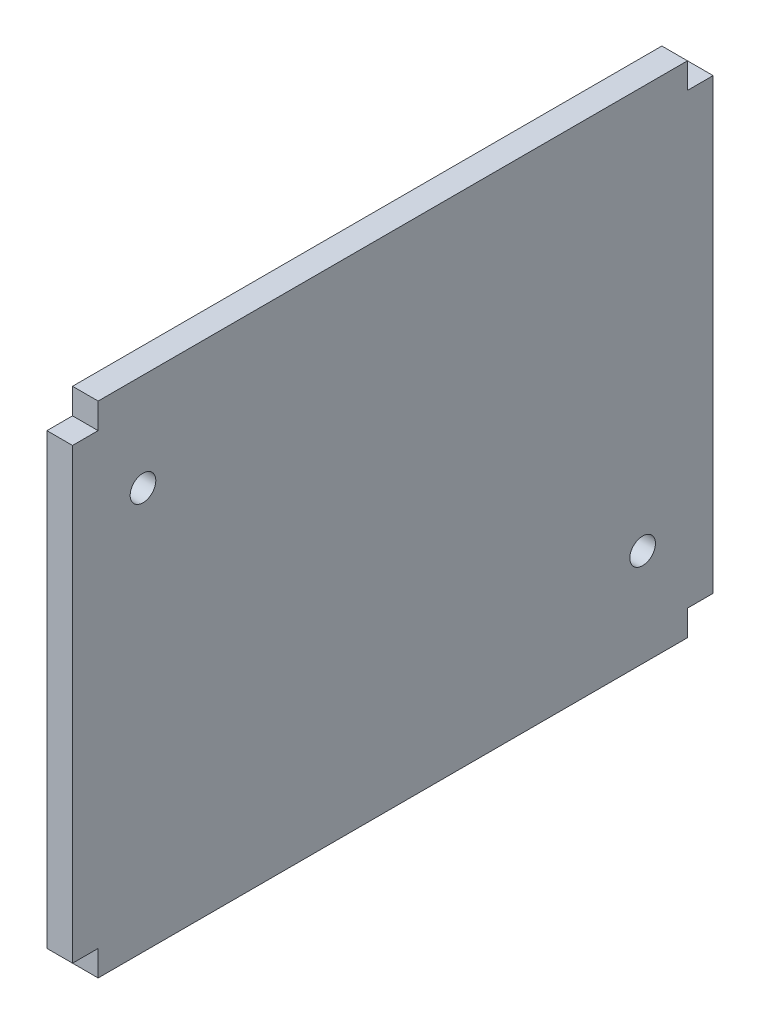
ISO-10303-21;
HEADER;
FILE_DESCRIPTION(('STEP AP214'),'2;1');
FILE_NAME('part.step','',(''),(''),'','','');
FILE_SCHEMA(('AUTOMOTIVE_DESIGN { 1 0 10303 214 1 1 1 1 }'));
ENDSEC;
DATA;
#1=APPLICATION_CONTEXT('core data for automotive mechanical design processes');
#2=APPLICATION_PROTOCOL_DEFINITION('international standard','automotive_design',2000,#1);
#3=PRODUCT_CONTEXT('',#1,'mechanical');
#4=PRODUCT('Part','Part','',(#3));
#5=PRODUCT_RELATED_PRODUCT_CATEGORY('part','',(#4));
#6=PRODUCT_DEFINITION_FORMATION('','',#4);
#7=PRODUCT_DEFINITION_CONTEXT('part definition',#1,'design');
#8=PRODUCT_DEFINITION('design','',#6,#7);
#9=PRODUCT_DEFINITION_SHAPE('','',#8);
#10=(LENGTH_UNIT() NAMED_UNIT(*) SI_UNIT(.MILLI.,.METRE.));
#11=(NAMED_UNIT(*) PLANE_ANGLE_UNIT() SI_UNIT($,.RADIAN.));
#12=(NAMED_UNIT(*) SI_UNIT($,.STERADIAN.) SOLID_ANGLE_UNIT());
#13=UNCERTAINTY_MEASURE_WITH_UNIT(LENGTH_MEASURE(1.E-05),#10,'distance_accuracy_value','');
#14=(GEOMETRIC_REPRESENTATION_CONTEXT(3) GLOBAL_UNCERTAINTY_ASSIGNED_CONTEXT((#13)) GLOBAL_UNIT_ASSIGNED_CONTEXT((#10,
#11,#12)) REPRESENTATION_CONTEXT('',''));
#15=CARTESIAN_POINT('',(0.,0.,0.));
#16=DIRECTION('',(0.,0.,1.));
#17=DIRECTION('',(1.,0.,0.));
#18=AXIS2_PLACEMENT_3D('',#15,#16,#17);
#19=CARTESIAN_POINT('',(4.,0.,50.));
#20=DIRECTION('',(0.,0.,-1.));
#21=DIRECTION('',(-1.,0.,0.));
#22=AXIS2_PLACEMENT_3D('',#19,#20,#21);
#23=PLANE('',#22);
#24=DIRECTION('',(0.,-1.,0.));
#25=VECTOR('',#24,1.);
#26=CARTESIAN_POINT('',(0.,0.,50.));
#27=LINE('',#26,#25);
#28=CARTESIAN_POINT('',(0.,35.,50.));
#29=VERTEX_POINT('',#28);
#30=CARTESIAN_POINT('',(0.,-35.,50.));
#31=VERTEX_POINT('',#30);
#32=EDGE_CURVE('E153',#29,#31,#27,.T.);
#33=ORIENTED_EDGE('',*,*,#32,.T.);
#34=DIRECTION('',(-1.,0.,0.));
#35=VECTOR('',#34,1.);
#36=CARTESIAN_POINT('',(4.,-35.,50.));
#37=LINE('',#36,#35);
#38=CARTESIAN_POINT('',(4.,-35.,50.));
#39=VERTEX_POINT('',#38);
#40=EDGE_CURVE('E11',#39,#31,#37,.T.);
#41=ORIENTED_EDGE('',*,*,#40,.F.);
#42=DIRECTION('',(0.,-1.,0.));
#43=VECTOR('',#42,1.);
#44=CARTESIAN_POINT('',(4.,0.,50.));
#45=LINE('',#44,#43);
#46=CARTESIAN_POINT('',(4.,35.,50.));
#47=VERTEX_POINT('',#46);
#48=EDGE_CURVE('E183',#47,#39,#45,.T.);
#49=ORIENTED_EDGE('',*,*,#48,.F.);
#50=DIRECTION('',(-1.,0.,0.));
#51=VECTOR('',#50,1.);
#52=CARTESIAN_POINT('',(4.,35.,50.));
#53=LINE('',#52,#51);
#54=EDGE_CURVE('E49',#47,#29,#53,.T.);
#55=ORIENTED_EDGE('',*,*,#54,.T.);
#56=EDGE_LOOP('',(#33,#41,#49,#55));
#57=FACE_BOUND('',#56,.T.);
#58=ADVANCED_FACE('F33',(#57),#23,.F.);
#59=CARTESIAN_POINT('',(4.,-35.,0.));
#60=DIRECTION('',(0.,1.,0.));
#61=DIRECTION('',(0.,0.,1.));
#62=AXIS2_PLACEMENT_3D('',#59,#60,#61);
#63=PLANE('',#62);
#64=DIRECTION('',(0.,0.,-1.));
#65=VECTOR('',#64,1.);
#66=CARTESIAN_POINT('',(0.,-35.,0.));
#67=LINE('',#66,#65);
#68=CARTESIAN_POINT('',(0.,-35.,46.));
#69=VERTEX_POINT('',#68);
#70=EDGE_CURVE('E155',#31,#69,#67,.T.);
#71=ORIENTED_EDGE('',*,*,#70,.T.);
#72=DIRECTION('',(-1.,0.,0.));
#73=VECTOR('',#72,1.);
#74=CARTESIAN_POINT('',(4.,-35.,46.));
#75=LINE('',#74,#73);
#76=CARTESIAN_POINT('',(4.,-35.,46.));
#77=VERTEX_POINT('',#76);
#78=EDGE_CURVE('E41',#77,#69,#75,.T.);
#79=ORIENTED_EDGE('',*,*,#78,.F.);
#80=DIRECTION('',(0.,0.,-1.));
#81=VECTOR('',#80,1.);
#82=CARTESIAN_POINT('',(4.,-35.,0.));
#83=LINE('',#82,#81);
#84=EDGE_CURVE('E99',#39,#77,#83,.T.);
#85=ORIENTED_EDGE('',*,*,#84,.F.);
#86=ORIENTED_EDGE('',*,*,#40,.T.);
#87=EDGE_LOOP('',(#71,#79,#85,#86));
#88=FACE_BOUND('',#87,.T.);
#89=ADVANCED_FACE('F253',(#88),#63,.F.);
#90=CARTESIAN_POINT('',(4.,0.,46.));
#91=DIRECTION('',(0.,0.,-1.));
#92=DIRECTION('',(-1.,0.,0.));
#93=AXIS2_PLACEMENT_3D('',#90,#91,#92);
#94=PLANE('',#93);
#95=DIRECTION('',(0.,-1.,0.));
#96=VECTOR('',#95,1.);
#97=CARTESIAN_POINT('',(0.,0.,46.));
#98=LINE('',#97,#96);
#99=CARTESIAN_POINT('',(0.,-39.,46.));
#100=VERTEX_POINT('',#99);
#101=EDGE_CURVE('E158',#69,#100,#98,.T.);
#102=ORIENTED_EDGE('',*,*,#101,.T.);
#103=DIRECTION('',(-1.,0.,0.));
#104=VECTOR('',#103,1.);
#105=CARTESIAN_POINT('',(4.,-39.,46.));
#106=LINE('',#105,#104);
#107=CARTESIAN_POINT('',(4.,-39.,46.));
#108=VERTEX_POINT('',#107);
#109=EDGE_CURVE('E198',#108,#100,#106,.T.);
#110=ORIENTED_EDGE('',*,*,#109,.F.);
#111=DIRECTION('',(0.,-1.,0.));
#112=VECTOR('',#111,1.);
#113=CARTESIAN_POINT('',(4.,0.,46.));
#114=LINE('',#113,#112);
#115=EDGE_CURVE('E206',#77,#108,#114,.T.);
#116=ORIENTED_EDGE('',*,*,#115,.F.);
#117=ORIENTED_EDGE('',*,*,#78,.T.);
#118=EDGE_LOOP('',(#102,#110,#116,#117));
#119=FACE_BOUND('',#118,.T.);
#120=ADVANCED_FACE('F204',(#119),#94,.F.);
#121=CARTESIAN_POINT('',(4.,-39.,0.));
#122=DIRECTION('',(0.,1.,0.));
#123=DIRECTION('',(0.,0.,1.));
#124=AXIS2_PLACEMENT_3D('',#121,#122,#123);
#125=PLANE('',#124);
#126=DIRECTION('',(0.,0.,-1.));
#127=VECTOR('',#126,1.);
#128=CARTESIAN_POINT('',(0.,-39.,0.));
#129=LINE('',#128,#127);
#130=CARTESIAN_POINT('',(0.,-39.,-46.));
#131=VERTEX_POINT('',#130);
#132=EDGE_CURVE('E160',#100,#131,#129,.T.);
#133=ORIENTED_EDGE('',*,*,#132,.T.);
#134=DIRECTION('',(-1.,0.,0.));
#135=VECTOR('',#134,1.);
#136=CARTESIAN_POINT('',(4.,-39.,-46.));
#137=LINE('',#136,#135);
#138=CARTESIAN_POINT('',(4.,-39.,-46.));
#139=VERTEX_POINT('',#138);
#140=EDGE_CURVE('E196',#139,#131,#137,.T.);
#141=ORIENTED_EDGE('',*,*,#140,.F.);
#142=DIRECTION('',(0.,0.,-1.));
#143=VECTOR('',#142,1.);
#144=CARTESIAN_POINT('',(4.,-39.,0.));
#145=LINE('',#144,#143);
#146=EDGE_CURVE('E216',#108,#139,#145,.T.);
#147=ORIENTED_EDGE('',*,*,#146,.F.);
#148=ORIENTED_EDGE('',*,*,#109,.T.);
#149=EDGE_LOOP('',(#133,#141,#147,#148));
#150=FACE_BOUND('',#149,.T.);
#151=ADVANCED_FACE('F213',(#150),#125,.F.);
#152=CARTESIAN_POINT('',(4.,0.,-46.));
#153=DIRECTION('',(0.,0.,-1.));
#154=DIRECTION('',(-1.,0.,0.));
#155=AXIS2_PLACEMENT_3D('',#152,#153,#154);
#156=PLANE('',#155);
#157=DIRECTION('',(0.,-1.,0.));
#158=VECTOR('',#157,1.);
#159=CARTESIAN_POINT('',(0.,0.,-46.));
#160=LINE('',#159,#158);
#161=CARTESIAN_POINT('',(0.,-35.,-46.));
#162=VERTEX_POINT('',#161);
#163=EDGE_CURVE('E163',#162,#131,#160,.T.);
#164=ORIENTED_EDGE('',*,*,#163,.F.);
#165=DIRECTION('',(-1.,0.,0.));
#166=VECTOR('',#165,1.);
#167=CARTESIAN_POINT('',(4.,-35.,-46.));
#168=LINE('',#167,#166);
#169=CARTESIAN_POINT('',(4.,-35.,-46.));
#170=VERTEX_POINT('',#169);
#171=EDGE_CURVE('E194',#170,#162,#168,.T.);
#172=ORIENTED_EDGE('',*,*,#171,.F.);
#173=DIRECTION('',(0.,-1.,0.));
#174=VECTOR('',#173,1.);
#175=CARTESIAN_POINT('',(4.,0.,-46.));
#176=LINE('',#175,#174);
#177=EDGE_CURVE('E218',#170,#139,#176,.T.);
#178=ORIENTED_EDGE('',*,*,#177,.T.);
#179=ORIENTED_EDGE('',*,*,#140,.T.);
#180=EDGE_LOOP('',(#164,#172,#178,#179));
#181=FACE_BOUND('',#180,.T.);
#182=ADVANCED_FACE('F366',(#181),#156,.T.);
#183=CARTESIAN_POINT('',(4.,-35.,0.));
#184=DIRECTION('',(0.,-1.,0.));
#185=DIRECTION('',(0.,0.,-1.));
#186=AXIS2_PLACEMENT_3D('',#183,#184,#185);
#187=PLANE('',#186);
#188=DIRECTION('',(0.,0.,1.));
#189=VECTOR('',#188,1.);
#190=CARTESIAN_POINT('',(0.,-35.,0.));
#191=LINE('',#190,#189);
#192=CARTESIAN_POINT('',(0.,-35.,-50.));
#193=VERTEX_POINT('',#192);
#194=EDGE_CURVE('E166',#193,#162,#191,.T.);
#195=ORIENTED_EDGE('',*,*,#194,.F.);
#196=DIRECTION('',(-1.,0.,0.));
#197=VECTOR('',#196,1.);
#198=CARTESIAN_POINT('',(4.,-35.,-50.));
#199=LINE('',#198,#197);
#200=CARTESIAN_POINT('',(4.,-35.,-50.));
#201=VERTEX_POINT('',#200);
#202=EDGE_CURVE('E192',#201,#193,#199,.T.);
#203=ORIENTED_EDGE('',*,*,#202,.F.);
#204=DIRECTION('',(0.,0.,1.));
#205=VECTOR('',#204,1.);
#206=CARTESIAN_POINT('',(4.,-35.,0.));
#207=LINE('',#206,#205);
#208=EDGE_CURVE('E220',#201,#170,#207,.T.);
#209=ORIENTED_EDGE('',*,*,#208,.T.);
#210=ORIENTED_EDGE('',*,*,#171,.T.);
#211=EDGE_LOOP('',(#195,#203,#209,#210));
#212=FACE_BOUND('',#211,.T.);
#213=ADVANCED_FACE('F356',(#212),#187,.T.);
#214=CARTESIAN_POINT('',(4.,0.,-50.));
#215=DIRECTION('',(0.,0.,-1.));
#216=DIRECTION('',(-1.,0.,0.));
#217=AXIS2_PLACEMENT_3D('',#214,#215,#216);
#218=PLANE('',#217);
#219=DIRECTION('',(0.,-1.,0.));
#220=VECTOR('',#219,1.);
#221=CARTESIAN_POINT('',(0.,0.,-50.));
#222=LINE('',#221,#220);
#223=CARTESIAN_POINT('',(0.,35.,-50.));
#224=VERTEX_POINT('',#223);
#225=EDGE_CURVE('E169',#224,#193,#222,.T.);
#226=ORIENTED_EDGE('',*,*,#225,.F.);
#227=DIRECTION('',(-1.,0.,0.));
#228=VECTOR('',#227,1.);
#229=CARTESIAN_POINT('',(4.,35.,-50.));
#230=LINE('',#229,#228);
#231=CARTESIAN_POINT('',(4.,35.,-50.));
#232=VERTEX_POINT('',#231);
#233=EDGE_CURVE('E190',#232,#224,#230,.T.);
#234=ORIENTED_EDGE('',*,*,#233,.F.);
#235=DIRECTION('',(0.,-1.,0.));
#236=VECTOR('',#235,1.);
#237=CARTESIAN_POINT('',(4.,0.,-50.));
#238=LINE('',#237,#236);
#239=EDGE_CURVE('E227',#232,#201,#238,.T.);
#240=ORIENTED_EDGE('',*,*,#239,.T.);
#241=ORIENTED_EDGE('',*,*,#202,.T.);
#242=EDGE_LOOP('',(#226,#234,#240,#241));
#243=FACE_BOUND('',#242,.T.);
#244=ADVANCED_FACE('F347',(#243),#218,.T.);
#245=CARTESIAN_POINT('',(4.,35.,0.));
#246=DIRECTION('',(0.,-1.,0.));
#247=DIRECTION('',(0.,0.,-1.));
#248=AXIS2_PLACEMENT_3D('',#245,#246,#247);
#249=PLANE('',#248);
#250=DIRECTION('',(0.,0.,1.));
#251=VECTOR('',#250,1.);
#252=CARTESIAN_POINT('',(0.,35.,0.));
#253=LINE('',#252,#251);
#254=CARTESIAN_POINT('',(0.,35.,-46.));
#255=VERTEX_POINT('',#254);
#256=EDGE_CURVE('E172',#224,#255,#253,.T.);
#257=ORIENTED_EDGE('',*,*,#256,.T.);
#258=DIRECTION('',(-1.,0.,0.));
#259=VECTOR('',#258,1.);
#260=CARTESIAN_POINT('',(4.,35.,-46.));
#261=LINE('',#260,#259);
#262=CARTESIAN_POINT('',(4.,35.,-46.));
#263=VERTEX_POINT('',#262);
#264=EDGE_CURVE('E187',#263,#255,#261,.T.);
#265=ORIENTED_EDGE('',*,*,#264,.F.);
#266=DIRECTION('',(0.,0.,1.));
#267=VECTOR('',#266,1.);
#268=CARTESIAN_POINT('',(4.,35.,0.));
#269=LINE('',#268,#267);
#270=EDGE_CURVE('E230',#232,#263,#269,.T.);
#271=ORIENTED_EDGE('',*,*,#270,.F.);
#272=ORIENTED_EDGE('',*,*,#233,.T.);
#273=EDGE_LOOP('',(#257,#265,#271,#272));
#274=FACE_BOUND('',#273,.T.);
#275=ADVANCED_FACE('F236',(#274),#249,.F.);
#276=CARTESIAN_POINT('',(4.,0.,-46.));
#277=DIRECTION('',(0.,0.,1.));
#278=DIRECTION('',(1.,0.,0.));
#279=AXIS2_PLACEMENT_3D('',#276,#277,#278);
#280=PLANE('',#279);
#281=DIRECTION('',(0.,1.,0.));
#282=VECTOR('',#281,1.);
#283=CARTESIAN_POINT('',(0.,0.,-46.));
#284=LINE('',#283,#282);
#285=CARTESIAN_POINT('',(0.,39.,-46.));
#286=VERTEX_POINT('',#285);
#287=EDGE_CURVE('E174',#255,#286,#284,.T.);
#288=ORIENTED_EDGE('',*,*,#287,.T.);
#289=DIRECTION('',(-1.,0.,0.));
#290=VECTOR('',#289,1.);
#291=CARTESIAN_POINT('',(4.,39.,-46.));
#292=LINE('',#291,#290);
#293=CARTESIAN_POINT('',(4.,39.,-46.));
#294=VERTEX_POINT('',#293);
#295=EDGE_CURVE('E136',#294,#286,#292,.T.);
#296=ORIENTED_EDGE('',*,*,#295,.F.);
#297=DIRECTION('',(0.,1.,0.));
#298=VECTOR('',#297,1.);
#299=CARTESIAN_POINT('',(4.,0.,-46.));
#300=LINE('',#299,#298);
#301=EDGE_CURVE('E144',#263,#294,#300,.T.);
#302=ORIENTED_EDGE('',*,*,#301,.F.);
#303=ORIENTED_EDGE('',*,*,#264,.T.);
#304=EDGE_LOOP('',(#288,#296,#302,#303));
#305=FACE_BOUND('',#304,.T.);
#306=ADVANCED_FACE('F240',(#305),#280,.F.);
#307=CARTESIAN_POINT('',(4.,39.,0.));
#308=DIRECTION('',(0.,1.,0.));
#309=DIRECTION('',(0.,0.,1.));
#310=AXIS2_PLACEMENT_3D('',#307,#308,#309);
#311=PLANE('',#310);
#312=DIRECTION('',(0.,0.,-1.));
#313=VECTOR('',#312,1.);
#314=CARTESIAN_POINT('',(0.,39.,0.));
#315=LINE('',#314,#313);
#316=CARTESIAN_POINT('',(0.,39.,46.));
#317=VERTEX_POINT('',#316);
#318=EDGE_CURVE('E132',#317,#286,#315,.T.);
#319=ORIENTED_EDGE('',*,*,#318,.F.);
#320=DIRECTION('',(-1.,0.,0.));
#321=VECTOR('',#320,1.);
#322=CARTESIAN_POINT('',(4.,39.,46.));
#323=LINE('',#322,#321);
#324=CARTESIAN_POINT('',(4.,39.,46.));
#325=VERTEX_POINT('',#324);
#326=EDGE_CURVE('E127',#325,#317,#323,.T.);
#327=ORIENTED_EDGE('',*,*,#326,.F.);
#328=DIRECTION('',(0.,0.,-1.));
#329=VECTOR('',#328,1.);
#330=CARTESIAN_POINT('',(4.,39.,0.));
#331=LINE('',#330,#329);
#332=EDGE_CURVE('E130',#325,#294,#331,.T.);
#333=ORIENTED_EDGE('',*,*,#332,.T.);
#334=ORIENTED_EDGE('',*,*,#295,.T.);
#335=EDGE_LOOP('',(#319,#327,#333,#334));
#336=FACE_BOUND('',#335,.T.);
#337=ADVANCED_FACE('F129',(#336),#311,.T.);
#338=CARTESIAN_POINT('',(4.,0.,46.));
#339=DIRECTION('',(0.,0.,1.));
#340=DIRECTION('',(1.,0.,0.));
#341=AXIS2_PLACEMENT_3D('',#338,#339,#340);
#342=PLANE('',#341);
#343=DIRECTION('',(0.,1.,0.));
#344=VECTOR('',#343,1.);
#345=CARTESIAN_POINT('',(0.,0.,46.));
#346=LINE('',#345,#344);
#347=CARTESIAN_POINT('',(0.,35.,46.));
#348=VERTEX_POINT('',#347);
#349=EDGE_CURVE('E178',#348,#317,#346,.T.);
#350=ORIENTED_EDGE('',*,*,#349,.F.);
#351=DIRECTION('',(-1.,0.,0.));
#352=VECTOR('',#351,1.);
#353=CARTESIAN_POINT('',(4.,35.,46.));
#354=LINE('',#353,#352);
#355=CARTESIAN_POINT('',(4.,35.,46.));
#356=VERTEX_POINT('',#355);
#357=EDGE_CURVE('E87',#356,#348,#354,.T.);
#358=ORIENTED_EDGE('',*,*,#357,.F.);
#359=DIRECTION('',(0.,1.,0.));
#360=VECTOR('',#359,1.);
#361=CARTESIAN_POINT('',(4.,0.,46.));
#362=LINE('',#361,#360);
#363=EDGE_CURVE('E142',#356,#325,#362,.T.);
#364=ORIENTED_EDGE('',*,*,#363,.T.);
#365=ORIENTED_EDGE('',*,*,#326,.T.);
#366=EDGE_LOOP('',(#350,#358,#364,#365));
#367=FACE_BOUND('',#366,.T.);
#368=ADVANCED_FACE('F147',(#367),#342,.T.);
#369=CARTESIAN_POINT('',(4.,35.,0.));
#370=DIRECTION('',(0.,1.,0.));
#371=DIRECTION('',(0.,0.,1.));
#372=AXIS2_PLACEMENT_3D('',#369,#370,#371);
#373=PLANE('',#372);
#374=DIRECTION('',(0.,0.,-1.));
#375=VECTOR('',#374,1.);
#376=CARTESIAN_POINT('',(0.,35.,0.));
#377=LINE('',#376,#375);
#378=EDGE_CURVE('E180',#29,#348,#377,.T.);
#379=ORIENTED_EDGE('',*,*,#378,.F.);
#380=ORIENTED_EDGE('',*,*,#54,.F.);
#381=DIRECTION('',(0.,0.,-1.));
#382=VECTOR('',#381,1.);
#383=CARTESIAN_POINT('',(4.,35.,0.));
#384=LINE('',#383,#382);
#385=EDGE_CURVE('E148',#47,#356,#384,.T.);
#386=ORIENTED_EDGE('',*,*,#385,.T.);
#387=ORIENTED_EDGE('',*,*,#357,.T.);
#388=EDGE_LOOP('',(#379,#380,#386,#387));
#389=FACE_BOUND('',#388,.T.);
#390=ADVANCED_FACE('F241',(#389),#373,.T.);
#391=CARTESIAN_POINT('',(4.,0.,0.));
#392=DIRECTION('',(1.,0.,0.));
#393=DIRECTION('',(0.,0.,-1.));
#394=AXIS2_PLACEMENT_3D('',#391,#392,#393);
#395=PLANE('',#394);
#396=CARTESIAN_POINT('',(4.,-23.75,-39.));
#397=DIRECTION('',(-1.,0.,0.));
#398=DIRECTION('',(0.,0.,1.));
#399=AXIS2_PLACEMENT_3D('',#396,#397,#398);
#400=CIRCLE('',#399,2.);
#401=CARTESIAN_POINT('',(4.,-23.75,-37.));
#402=VERTEX_POINT('',#401);
#403=EDGE_CURVE('E265',#402,#402,#400,.T.);
#404=ORIENTED_EDGE('',*,*,#403,.T.);
#405=EDGE_LOOP('',(#404));
#406=FACE_BOUND('',#405,.T.);
#407=CARTESIAN_POINT('',(4.,23.75,39.));
#408=DIRECTION('',(-1.,0.,0.));
#409=DIRECTION('',(0.,0.,1.));
#410=AXIS2_PLACEMENT_3D('',#407,#408,#409);
#411=CIRCLE('',#410,2.);
#412=CARTESIAN_POINT('',(4.,23.75,41.));
#413=VERTEX_POINT('',#412);
#414=EDGE_CURVE('E156',#413,#413,#411,.T.);
#415=ORIENTED_EDGE('',*,*,#414,.T.);
#416=EDGE_LOOP('',(#415));
#417=FACE_BOUND('',#416,.T.);
#418=ORIENTED_EDGE('',*,*,#48,.T.);
#419=ORIENTED_EDGE('',*,*,#84,.T.);
#420=ORIENTED_EDGE('',*,*,#115,.T.);
#421=ORIENTED_EDGE('',*,*,#146,.T.);
#422=ORIENTED_EDGE('',*,*,#177,.F.);
#423=ORIENTED_EDGE('',*,*,#208,.F.);
#424=ORIENTED_EDGE('',*,*,#239,.F.);
#425=ORIENTED_EDGE('',*,*,#270,.T.);
#426=ORIENTED_EDGE('',*,*,#301,.T.);
#427=ORIENTED_EDGE('',*,*,#332,.F.);
#428=ORIENTED_EDGE('',*,*,#363,.F.);
#429=ORIENTED_EDGE('',*,*,#385,.F.);
#430=EDGE_LOOP('',(#418,#419,#420,#421,#422,#423,#424,#425,#426,#427,#428,#429));
#431=FACE_BOUND('',#430,.T.);
#432=ADVANCED_FACE('F140',(#406,#417,#431),#395,.T.);
#433=CARTESIAN_POINT('',(0.,0.,0.));
#434=DIRECTION('',(1.,0.,0.));
#435=DIRECTION('',(0.,0.,-1.));
#436=AXIS2_PLACEMENT_3D('',#433,#434,#435);
#437=PLANE('',#436);
#438=CARTESIAN_POINT('',(0.,-23.75,-39.));
#439=DIRECTION('',(-1.,0.,0.));
#440=DIRECTION('',(0.,0.,1.));
#441=AXIS2_PLACEMENT_3D('',#438,#439,#440);
#442=CIRCLE('',#441,2.);
#443=CARTESIAN_POINT('',(0.,-23.75,-37.));
#444=VERTEX_POINT('',#443);
#445=EDGE_CURVE('E268',#444,#444,#442,.T.);
#446=ORIENTED_EDGE('',*,*,#445,.F.);
#447=EDGE_LOOP('',(#446));
#448=FACE_BOUND('',#447,.T.);
#449=CARTESIAN_POINT('',(0.,23.75,39.));
#450=DIRECTION('',(-1.,0.,0.));
#451=DIRECTION('',(0.,0.,1.));
#452=AXIS2_PLACEMENT_3D('',#449,#450,#451);
#453=CIRCLE('',#452,2.);
#454=CARTESIAN_POINT('',(0.,23.75,41.));
#455=VERTEX_POINT('',#454);
#456=EDGE_CURVE('E262',#455,#455,#453,.T.);
#457=ORIENTED_EDGE('',*,*,#456,.F.);
#458=EDGE_LOOP('',(#457));
#459=FACE_BOUND('',#458,.T.);
#460=ORIENTED_EDGE('',*,*,#32,.F.);
#461=ORIENTED_EDGE('',*,*,#378,.T.);
#462=ORIENTED_EDGE('',*,*,#349,.T.);
#463=ORIENTED_EDGE('',*,*,#318,.T.);
#464=ORIENTED_EDGE('',*,*,#287,.F.);
#465=ORIENTED_EDGE('',*,*,#256,.F.);
#466=ORIENTED_EDGE('',*,*,#225,.T.);
#467=ORIENTED_EDGE('',*,*,#194,.T.);
#468=ORIENTED_EDGE('',*,*,#163,.T.);
#469=ORIENTED_EDGE('',*,*,#132,.F.);
#470=ORIENTED_EDGE('',*,*,#101,.F.);
#471=ORIENTED_EDGE('',*,*,#70,.F.);
#472=EDGE_LOOP('',(#460,#461,#462,#463,#464,#465,#466,#467,#468,#469,#470,#471));
#473=FACE_BOUND('',#472,.T.);
#474=ADVANCED_FACE('F209',(#448,#459,#473),#437,.F.);
#475=CARTESIAN_POINT('',(0.,23.75,39.));
#476=DIRECTION('',(-1.,0.,0.));
#477=DIRECTION('',(0.,0.,1.));
#478=AXIS2_PLACEMENT_3D('',#475,#476,#477);
#479=CYLINDRICAL_SURFACE('',#478,2.);
#480=ORIENTED_EDGE('',*,*,#414,.F.);
#481=EDGE_LOOP('',(#480));
#482=FACE_BOUND('',#481,.T.);
#483=ORIENTED_EDGE('',*,*,#456,.T.);
#484=EDGE_LOOP('',(#483));
#485=FACE_BOUND('',#484,.T.);
#486=ADVANCED_FACE('F276',(#482,#485),#479,.F.);
#487=CARTESIAN_POINT('',(0.,-23.75,-39.));
#488=DIRECTION('',(-1.,0.,0.));
#489=DIRECTION('',(0.,0.,1.));
#490=AXIS2_PLACEMENT_3D('',#487,#488,#489);
#491=CYLINDRICAL_SURFACE('',#490,2.);
#492=ORIENTED_EDGE('',*,*,#403,.F.);
#493=EDGE_LOOP('',(#492));
#494=FACE_BOUND('',#493,.T.);
#495=ORIENTED_EDGE('',*,*,#445,.T.);
#496=EDGE_LOOP('',(#495));
#497=FACE_BOUND('',#496,.T.);
#498=ADVANCED_FACE('F272',(#494,#497),#491,.F.);
#499=CLOSED_SHELL('',(#58,#89,#120,#151,#182,#213,#244,#275,#306,#337,#368,#390,#432,#474,#486,#498));
#500=MANIFOLD_SOLID_BREP('B2',#499);
#501=ADVANCED_BREP_SHAPE_REPRESENTATION('',(#18,#500),#14);
#502=SHAPE_DEFINITION_REPRESENTATION(#9,#501);
ENDSEC;
END-ISO-10303-21;
